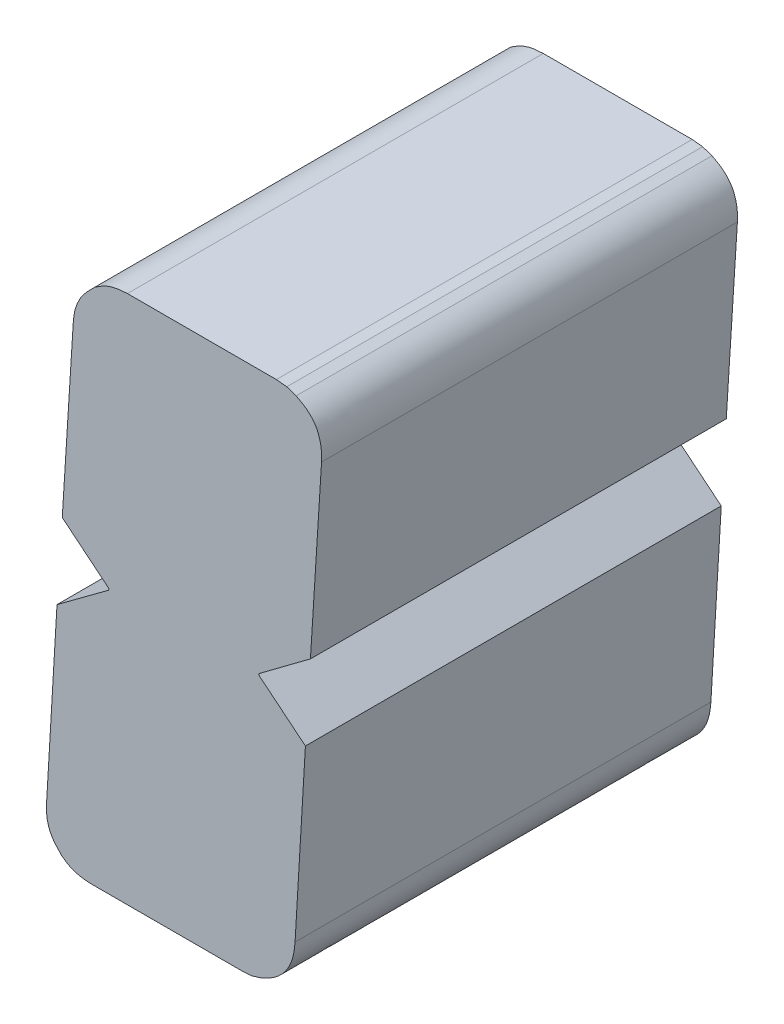
ISO-10303-21;
HEADER;
FILE_DESCRIPTION(('STEP AP214'),'2;1');
FILE_NAME('part.step','',(''),(''),'','','');
FILE_SCHEMA(('AUTOMOTIVE_DESIGN { 1 0 10303 214 1 1 1 1 }'));
ENDSEC;
DATA;
#1=APPLICATION_CONTEXT('core data for automotive mechanical design processes');
#2=APPLICATION_PROTOCOL_DEFINITION('international standard','automotive_design',2000,#1);
#3=PRODUCT_CONTEXT('',#1,'mechanical');
#4=PRODUCT('Part','Part','',(#3));
#5=PRODUCT_RELATED_PRODUCT_CATEGORY('part','',(#4));
#6=PRODUCT_DEFINITION_FORMATION('','',#4);
#7=PRODUCT_DEFINITION_CONTEXT('part definition',#1,'design');
#8=PRODUCT_DEFINITION('design','',#6,#7);
#9=PRODUCT_DEFINITION_SHAPE('','',#8);
#10=(LENGTH_UNIT() NAMED_UNIT(*) SI_UNIT(.MILLI.,.METRE.));
#11=(NAMED_UNIT(*) PLANE_ANGLE_UNIT() SI_UNIT($,.RADIAN.));
#12=(NAMED_UNIT(*) SI_UNIT($,.STERADIAN.) SOLID_ANGLE_UNIT());
#13=UNCERTAINTY_MEASURE_WITH_UNIT(LENGTH_MEASURE(1.E-05),#10,'distance_accuracy_value','');
#14=(GEOMETRIC_REPRESENTATION_CONTEXT(3) GLOBAL_UNCERTAINTY_ASSIGNED_CONTEXT((#13)) GLOBAL_UNIT_ASSIGNED_CONTEXT((#10,
#11,#12)) REPRESENTATION_CONTEXT('',''));
#15=CARTESIAN_POINT('',(0.,0.,0.));
#16=DIRECTION('',(0.,0.,1.));
#17=DIRECTION('',(1.,0.,0.));
#18=AXIS2_PLACEMENT_3D('',#15,#16,#17);
#19=CARTESIAN_POINT('',(-1.43719380701139,-2.18516352004764,0.));
#20=DIRECTION('',(0.,0.,-1.));
#21=DIRECTION('',(-1.,0.,0.));
#22=AXIS2_PLACEMENT_3D('',#19,#20,#21);
#23=PLANE('',#22);
#24=DIRECTION('',(-0.0629956112398929,-0.998013803994971,0.));
#25=VECTOR('',#24,1.);
#26=CARTESIAN_POINT('',(-0.996859150546409,2.17540462830096,0.));
#27=LINE('',#26,#25);
#28=CARTESIAN_POINT('',(-1.01112432138006,1.94940733851967,0.));
#29=VERTEX_POINT('',#28);
#30=CARTESIAN_POINT('',(-1.11218839294053,0.348290427038476,0.));
#31=VERTEX_POINT('',#30);
#32=EDGE_CURVE('E443',#29,#31,#27,.T.);
#33=ORIENTED_EDGE('',*,*,#32,.F.);
#34=CARTESIAN_POINT('',(-0.890962738372066,2.24236027187582,0.));
#35=CARTESIAN_POINT('',(-0.908040344985416,2.2216435503971,0.));
#36=CARTESIAN_POINT('',(-0.925227905547242,2.20099741701442,0.));
#37=CARTESIAN_POINT('',(-0.954461408277091,2.15640434061114,0.));
#38=CARTESIAN_POINT('',(-0.966010445699758,2.1320552290783,0.));
#39=CARTESIAN_POINT('',(-0.986425308372956,2.08199531247794,0.));
#40=CARTESIAN_POINT('',(-0.995138703432248,2.05640124055581,0.));
#41=CARTESIAN_POINT('',(-1.00571753288547,2.00325943194031,0.));
#42=CARTESIAN_POINT('',(-1.00832936844511,1.97632081132636,0.));
#43=CARTESIAN_POINT('',(-1.01112432138006,1.94940733851967,0.));
#44=B_SPLINE_CURVE_WITH_KNOTS('',3,(#34,#35,#36,#37,#38,#39,#40,#41,#42,#43),.UNSPECIFIED.,.F.,
.F.,(4,2,2,2,4),(0.,0.25,0.5,0.75,1.),.UNSPECIFIED.);
#45=CARTESIAN_POINT('',(-0.890962738372066,2.24236027187582,0.));
#46=VERTEX_POINT('',#45);
#47=EDGE_CURVE('E277',#46,#29,#44,.T.);
#48=ORIENTED_EDGE('',*,*,#47,.F.);
#49=DIRECTION('',(-0.699624792608215,-0.714510426493493,0.));
#50=VECTOR('',#49,1.);
#51=CARTESIAN_POINT('',(-1.05102460286801,2.07889283579486,0.));
#52=LINE('',#51,#50);
#53=CARTESIAN_POINT('',(-0.816049696278487,2.31886720848203,0.));
#54=VERTEX_POINT('',#53);
#55=EDGE_CURVE('E514',#54,#46,#52,.T.);
#56=ORIENTED_EDGE('',*,*,#55,.F.);
#57=CARTESIAN_POINT('',(-0.516702668850851,2.41871701152775,0.));
#58=CARTESIAN_POINT('',(-0.570312193003978,2.41647998090553,0.));
#59=CARTESIAN_POINT('',(-0.623850036610658,2.41190232353293,0.));
#60=CARTESIAN_POINT('',(-0.726132172515437,2.37713701742197,0.));
#61=CARTESIAN_POINT('',(-0.771962058489298,2.34965807582881,0.));
#62=CARTESIAN_POINT('',(-0.816049696278484,2.31886720848204,0.));
#63=B_SPLINE_CURVE_WITH_KNOTS('',3,(#57,#58,#59,#60,#61,#62),.UNSPECIFIED.,.F.,.F.,(4,2,4),(0.,
0.5,1.),.UNSPECIFIED.);
#64=CARTESIAN_POINT('',(-0.516702668850851,2.41871701152775,0.));
#65=VERTEX_POINT('',#64);
#66=EDGE_CURVE('E517',#65,#54,#63,.T.);
#67=ORIENTED_EDGE('',*,*,#66,.F.);
#68=DIRECTION('',(-1.,0.,0.));
#69=VECTOR('',#68,1.);
#70=CARTESIAN_POINT('',(-1.16011388815208,2.41871701152775,0.));
#71=LINE('',#70,#69);
#72=CARTESIAN_POINT('',(0.844231341113559,2.41871701152775,0.));
#73=VERTEX_POINT('',#72);
#74=EDGE_CURVE('E520',#73,#65,#71,.T.);
#75=ORIENTED_EDGE('',*,*,#74,.F.);
#76=DIRECTION('',(-0.99488208865454,0.10104271212898,0.));
#77=VECTOR('',#76,1.);
#78=CARTESIAN_POINT('',(-1.11622704206118,2.61782606606894,0.));
#79=LINE('',#78,#77);
#80=CARTESIAN_POINT('',(0.939111556732335,2.40908073962897,0.));
#81=VERTEX_POINT('',#80);
#82=EDGE_CURVE('E684',#81,#73,#79,.T.);
#83=ORIENTED_EDGE('',*,*,#82,.F.);
#84=DIRECTION('',(-0.946291022800123,0.323316099456704,0.));
#85=VECTOR('',#84,1.);
#86=CARTESIAN_POINT('',(-0.872334220976006,3.02799138034597,0.));
#87=LINE('',#86,#85);
#88=CARTESIAN_POINT('',(1.02473831085206,2.3798249319714,0.));
#89=VERTEX_POINT('',#88);
#90=EDGE_CURVE('E685',#89,#81,#87,.T.);
#91=ORIENTED_EDGE('',*,*,#90,.F.);
#92=CARTESIAN_POINT('',(1.25727268702418,1.97236385982051,0.));
#93=CARTESIAN_POINT('',(1.2581138756825,2.01430850970678,0.));
#94=CARTESIAN_POINT('',(1.25841778484488,2.05618374871578,0.));
#95=CARTESIAN_POINT('',(1.24420198154978,2.13801917025248,0.));
#96=CARTESIAN_POINT('',(1.23225328315968,2.17942948606228,0.));
#97=CARTESIAN_POINT('',(1.19270387969881,2.25317642300351,0.));
#98=CARTESIAN_POINT('',(1.16434271527264,2.28569752565159,0.));
#99=CARTESIAN_POINT('',(1.10027483678842,2.34020055274425,0.));
#100=CARTESIAN_POINT('',(1.06276723899746,2.36089711384039,0.));
#101=CARTESIAN_POINT('',(1.02473831085199,2.37982493197143,0.));
#102=B_SPLINE_CURVE_WITH_KNOTS('',3,(#92,#93,#94,#95,#96,#97,#98,#99,#100,#101),.UNSPECIFIED.,
.F.,.F.,(4,2,2,2,4),(0.,0.25,0.5,0.75,1.),.UNSPECIFIED.);
#103=CARTESIAN_POINT('',(1.25727268702418,1.97236385982051,0.));
#104=VERTEX_POINT('',#103);
#105=EDGE_CURVE('E690',#104,#89,#102,.T.);
#106=ORIENTED_EDGE('',*,*,#105,.F.);
#107=DIRECTION('',(0.063069040355427,0.998009166365042,0.));
#108=VECTOR('',#107,1.);
#109=CARTESIAN_POINT('',(1.26108575169763,2.03270207766256,0.));
#110=LINE('',#109,#108);
#111=CARTESIAN_POINT('',(1.15559408106132,0.363394067315748,0.));
#112=VERTEX_POINT('',#111);
#113=EDGE_CURVE('E696',#112,#104,#110,.T.);
#114=ORIENTED_EDGE('',*,*,#113,.F.);
#115=DIRECTION('',(0.801257856401325,0.598319185347715,0.));
#116=VECTOR('',#115,1.);
#117=CARTESIAN_POINT('',(0.542509259206344,-0.0944116293532548,0.));
#118=LINE('',#117,#116);
#119=CARTESIAN_POINT('',(0.683073322133881,0.0105510551908889,0.));
#120=VERTEX_POINT('',#119);
#121=EDGE_CURVE('E763',#120,#112,#118,.T.);
#122=ORIENTED_EDGE('',*,*,#121,.F.);
#123=DIRECTION('',(-0.784634745814209,0.619958317680367,0.));
#124=VECTOR('',#123,1.);
#125=CARTESIAN_POINT('',(-1.50977384774873,1.74317104127099,0.));
#126=LINE('',#125,#124);
#127=CARTESIAN_POINT('',(0.686913474937316,0.00751686038323663,0.));
#128=VERTEX_POINT('',#127);
#129=EDGE_CURVE('E761',#128,#120,#126,.T.);
#130=ORIENTED_EDGE('',*,*,#129,.F.);
#131=DIRECTION('',(0.811880248653885,0.583823999031992,0.));
#132=VECTOR('',#131,1.);
#133=CARTESIAN_POINT('',(0.501899005438895,-0.1255272525145,0.));
#134=LINE('',#133,#132);
#135=CARTESIAN_POINT('',(0.680300718272833,0.00276161963574346,0.));
#136=VERTEX_POINT('',#135);
#137=EDGE_CURVE('E758',#136,#128,#134,.T.);
#138=ORIENTED_EDGE('',*,*,#137,.F.);
#139=DIRECTION('',(-0.773957299203321,0.633237790257262,0.));
#140=VECTOR('',#139,1.);
#141=CARTESIAN_POINT('',(-1.49198641226871,1.78008745371518,0.));
#142=LINE('',#141,#140);
#143=CARTESIAN_POINT('',(1.10975234037325,-0.348607889355504,0.));
#144=VERTEX_POINT('',#143);
#145=EDGE_CURVE('E755',#144,#136,#142,.T.);
#146=ORIENTED_EDGE('',*,*,#145,.F.);
#147=DIRECTION('',(0.0590303717234863,0.998256187165493,0.));
#148=VECTOR('',#147,1.);
#149=CARTESIAN_POINT('',(1.25118361498193,2.04312099214573,0.));
#150=LINE('',#149,#148);
#151=CARTESIAN_POINT('',(1.0152121936779,-1.94736601366888,0.));
#152=VERTEX_POINT('',#151);
#153=EDGE_CURVE('E747',#152,#144,#150,.T.);
#154=ORIENTED_EDGE('',*,*,#153,.F.);
#155=CARTESIAN_POINT('',(0.709904759173197,-2.38462017092752,0.));
#156=CARTESIAN_POINT('',(0.752821680239164,-2.36489662640091,0.));
#157=CARTESIAN_POINT('',(0.795043998863421,-2.3441369487027,0.));
#158=CARTESIAN_POINT('',(0.870185675204184,-2.28874043737623,0.));
#159=CARTESIAN_POINT('',(0.904729385897159,-2.25456271232383,0.));
#160=CARTESIAN_POINT('',(0.958681636041364,-2.17703424930174,0.));
#161=CARTESIAN_POINT('',(0.979317246973203,-2.13322223892032,0.));
#162=CARTESIAN_POINT('',(1.00562776036756,-2.04237293710442,0.));
#163=CARTESIAN_POINT('',(1.01055566962311,-1.99479327532623,0.));
#164=CARTESIAN_POINT('',(1.0152121936779,-1.94736601366888,0.));
#165=B_SPLINE_CURVE_WITH_KNOTS('',3,(#155,#156,#157,#158,#159,#160,#161,#162,#163,#164),
.UNSPECIFIED.,.F.,.F.,(4,2,2,2,4),(0.,0.25,0.5,0.75,1.),.UNSPECIFIED.);
#166=CARTESIAN_POINT('',(0.709904759173197,-2.38462017092752,0.));
#167=VERTEX_POINT('',#166);
#168=EDGE_CURVE('E740',#167,#152,#165,.T.);
#169=ORIENTED_EDGE('',*,*,#168,.F.);
#170=DIRECTION('',(0.955136383278741,0.296166320396508,0.));
#171=VECTOR('',#170,1.);
#172=CARTESIAN_POINT('',(0.296765151610304,-2.51272547559818,0.));
#173=LINE('',#172,#171);
#174=CARTESIAN_POINT('',(0.617154733206031,-2.41337986890184,0.));
#175=VERTEX_POINT('',#174);
#176=EDGE_CURVE('E748',#175,#167,#173,.T.);
#177=ORIENTED_EDGE('',*,*,#176,.F.);
#178=DIRECTION('',(0.99850798449248,0.0546059054019324,0.));
#179=VECTOR('',#178,1.);
#180=CARTESIAN_POINT('',(-0.904051685745701,-2.49657084493826,0.));
#181=LINE('',#180,#179);
#182=CARTESIAN_POINT('',(0.519561268046444,-2.41871701152775,0.));
#183=VERTEX_POINT('',#182);
#184=EDGE_CURVE('E790',#183,#175,#181,.T.);
#185=ORIENTED_EDGE('',*,*,#184,.F.);
#186=DIRECTION('',(1.,0.,0.));
#187=VECTOR('',#186,1.);
#188=CARTESIAN_POINT('',(-1.16011388815208,-2.41871701152775,0.));
#189=LINE('',#188,#187);
#190=CARTESIAN_POINT('',(-0.843701006559318,-2.41871701152775,0.));
#191=VERTEX_POINT('',#190);
#192=EDGE_CURVE('E791',#191,#183,#189,.T.);
#193=ORIENTED_EDGE('',*,*,#192,.F.);
#194=CARTESIAN_POINT('',(-1.11755909845156,-2.33010674205506,0.));
#195=CARTESIAN_POINT('',(-1.09785273994237,-2.34479279060464,0.));
#196=CARTESIAN_POINT('',(-1.07810377865326,-2.35940160424777,0.));
#197=CARTESIAN_POINT('',(-1.03541007487244,-2.3828255752826,0.));
#198=CARTESIAN_POINT('',(-1.0124636893228,-2.39195523727551,0.));
#199=CARTESIAN_POINT('',(-0.941603833949698,-2.41357345525233,0.));
#200=CARTESIAN_POINT('',(-0.892704311148555,-2.41650421884631,0.));
#201=CARTESIAN_POINT('',(-0.843701006559312,-2.41871701152775,0.));
#202=B_SPLINE_CURVE_WITH_KNOTS('',3,(#194,#195,#196,#197,#198,#199,#200,#201),.UNSPECIFIED.,.F.,
.F.,(4,2,2,4),(0.,0.25,0.500000000000001,1.),.UNSPECIFIED.);
#203=CARTESIAN_POINT('',(-1.11755909845156,-2.33010674205506,0.));
#204=VERTEX_POINT('',#203);
#205=EDGE_CURVE('E794',#204,#191,#202,.T.);
#206=ORIENTED_EDGE('',*,*,#205,.F.);
#207=DIRECTION('',(0.675724628517347,-0.737154140200741,0.));
#208=VECTOR('',#207,1.);
#209=CARTESIAN_POINT('',(-3.38637745299081,0.144967826533329,0.));
#210=LINE('',#209,#208);
#211=CARTESIAN_POINT('',(-1.18314999807141,-2.25855303337875,0.));
#212=VERTEX_POINT('',#211);
#213=EDGE_CURVE('E464',#212,#204,#210,.T.);
#214=ORIENTED_EDGE('',*,*,#213,.F.);
#215=CARTESIAN_POINT('',(-1.25519712705628,-1.97462104315552,0.));
#216=CARTESIAN_POINT('',(-1.25703230873838,-2.02443157901301,0.));
#217=CARTESIAN_POINT('',(-1.25798384630833,-2.07442359628306,0.));
#218=CARTESIAN_POINT('',(-1.24075152722987,-2.14778758993915,0.));
#219=CARTESIAN_POINT('',(-1.23328040214714,-2.17182733541969,0.));
#220=CARTESIAN_POINT('',(-1.21152799941701,-2.21718178570002,0.));
#221=CARTESIAN_POINT('',(-1.19727292501901,-2.23782768708621,0.));
#222=CARTESIAN_POINT('',(-1.18314999807117,-2.25855303337911,0.));
#223=B_SPLINE_CURVE_WITH_KNOTS('',3,(#215,#216,#217,#218,#219,#220,#221,#222),.UNSPECIFIED.,.F.,
.F.,(4,2,2,4),(0.,0.5,0.75,1.),.UNSPECIFIED.);
#224=CARTESIAN_POINT('',(-1.25519712705628,-1.97462104315552,0.));
#225=VERTEX_POINT('',#224);
#226=EDGE_CURVE('E458',#225,#212,#223,.T.);
#227=ORIENTED_EDGE('',*,*,#226,.F.);
#228=DIRECTION('',(-0.058995951094308,-0.998258221981907,0.));
#229=VECTOR('',#228,1.);
#230=CARTESIAN_POINT('',(-1.00985104135484,2.1768290604462,0.));
#231=LINE('',#230,#229);
#232=CARTESIAN_POINT('',(-1.16004155867173,-0.364513455341602,0.));
#233=VERTEX_POINT('',#232);
#234=EDGE_CURVE('E455',#233,#225,#231,.T.);
#235=ORIENTED_EDGE('',*,*,#234,.F.);
#236=DIRECTION('',(-0.803311771616124,-0.595558727232642,0.));
#237=VECTOR('',#236,1.);
#238=CARTESIAN_POINT('',(0.0599877054320527,0.539990999080165,0.));
#239=LINE('',#238,#237);
#240=CARTESIAN_POINT('',(-0.684303055329405,-0.011810771829191,0.));
#241=VERTEX_POINT('',#240);
#242=EDGE_CURVE('E449',#241,#233,#239,.T.);
#243=ORIENTED_EDGE('',*,*,#242,.F.);
#244=DIRECTION('',(0.784634745814209,-0.619958317680367,0.));
#245=VECTOR('',#244,1.);
#246=CARTESIAN_POINT('',(-2.04620036115417,1.06425623524224,0.));
#247=LINE('',#246,#245);
#248=CARTESIAN_POINT('',(-0.689507134829485,-0.00769890654517713,0.));
#249=VERTEX_POINT('',#248);
#250=EDGE_CURVE('E447',#249,#241,#247,.T.);
#251=ORIENTED_EDGE('',*,*,#250,.F.);
#252=DIRECTION('',(-0.812500733959509,-0.582960167863345,0.));
#253=VECTOR('',#252,1.);
#254=CARTESIAN_POINT('',(0.0387383765617318,0.514809083690691,0.));
#255=LINE('',#254,#253);
#256=CARTESIAN_POINT('',(-0.682891644982969,-0.00295236674498595,0.));
#257=VERTEX_POINT('',#256);
#258=EDGE_CURVE('E430',#257,#249,#255,.T.);
#259=ORIENTED_EDGE('',*,*,#258,.F.);
#260=DIRECTION('',(0.773957299203321,-0.633237790257263,0.));
#261=VECTOR('',#260,1.);
#262=CARTESIAN_POINT('',(-2.04141347204797,1.10856549176275,0.));
#263=LINE('',#262,#261);
#264=EDGE_CURVE('E438',#31,#257,#263,.T.);
#265=ORIENTED_EDGE('',*,*,#264,.F.);
#266=EDGE_LOOP('',(#33,#48,#56,#67,#75,#83,#91,#106,#114,#122,#130,#138,#146,#154,#169,#177,
#185,#193,#206,#214,#227,#235,#243,#251,#259,#265));
#267=FACE_BOUND('',#266,.T.);
#268=ADVANCED_FACE('F253',(#267),#23,.T.);
#269=DIRECTION('',(0.,0.,1.));
#270=VECTOR('',#269,1.);
#271=SURFACE_OF_LINEAR_EXTRUSION('',#44,#270);
#272=CARTESIAN_POINT('',(-0.890962738372066,2.24236027187582,3.8));
#273=CARTESIAN_POINT('',(-0.908040344985416,2.2216435503971,3.8));
#274=CARTESIAN_POINT('',(-0.925227905547242,2.20099741701442,3.8));
#275=CARTESIAN_POINT('',(-0.954461408277091,2.15640434061114,3.8));
#276=CARTESIAN_POINT('',(-0.966010445699758,2.1320552290783,3.8));
#277=CARTESIAN_POINT('',(-0.986425308372956,2.08199531247794,3.8));
#278=CARTESIAN_POINT('',(-0.995138703432248,2.05640124055581,3.8));
#279=CARTESIAN_POINT('',(-1.00571753288547,2.00325943194031,3.8));
#280=CARTESIAN_POINT('',(-1.00832936844511,1.97632081132636,3.8));
#281=CARTESIAN_POINT('',(-1.01112432138006,1.94940733851967,3.8));
#282=B_SPLINE_CURVE_WITH_KNOTS('',3,(#272,#273,#274,#275,#276,#277,#278,#279,#280,#281),
.UNSPECIFIED.,.F.,.F.,(4,2,2,2,4),(0.,0.25,0.5,0.75,1.),.UNSPECIFIED.);
#283=CARTESIAN_POINT('',(-0.890962738372066,2.24236027187582,3.8));
#284=VERTEX_POINT('',#283);
#285=CARTESIAN_POINT('',(-1.01112432138006,1.94940733851967,3.8));
#286=VERTEX_POINT('',#285);
#287=EDGE_CURVE('E527',#284,#286,#282,.T.);
#288=ORIENTED_EDGE('',*,*,#287,.F.);
#289=DIRECTION('',(0.,0.,1.));
#290=VECTOR('',#289,1.);
#291=CARTESIAN_POINT('',(-0.890962738372066,2.24236027187582,0.));
#292=LINE('',#291,#290);
#293=EDGE_CURVE('E12',#46,#284,#292,.T.);
#294=ORIENTED_EDGE('',*,*,#293,.F.);
#295=ORIENTED_EDGE('',*,*,#47,.T.);
#296=DIRECTION('',(0.,0.,1.));
#297=VECTOR('',#296,1.);
#298=CARTESIAN_POINT('',(-1.01112432138006,1.94940733851967,0.));
#299=LINE('',#298,#297);
#300=EDGE_CURVE('E256',#29,#286,#299,.T.);
#301=ORIENTED_EDGE('',*,*,#300,.T.);
#302=EDGE_LOOP('',(#288,#294,#295,#301));
#303=FACE_BOUND('',#302,.T.);
#304=ADVANCED_FACE('F498',(#303),#271,.T.);
#305=CARTESIAN_POINT('',(-1.05102460286801,2.07889283579486,0.));
#306=DIRECTION('',(-0.714510426493493,0.699624792608215,0.));
#307=DIRECTION('',(-0.699624792608215,-0.714510426493493,0.));
#308=AXIS2_PLACEMENT_3D('',#305,#306,#307);
#309=PLANE('',#308);
#310=DIRECTION('',(-0.699624792608215,-0.714510426493493,0.));
#311=VECTOR('',#310,1.);
#312=CARTESIAN_POINT('',(-1.05102460286801,2.07889283579486,3.8));
#313=LINE('',#312,#311);
#314=CARTESIAN_POINT('',(-0.816049696278487,2.31886720848203,3.8));
#315=VERTEX_POINT('',#314);
#316=EDGE_CURVE('E505',#315,#284,#313,.T.);
#317=ORIENTED_EDGE('',*,*,#316,.F.);
#318=DIRECTION('',(0.,0.,1.));
#319=VECTOR('',#318,1.);
#320=CARTESIAN_POINT('',(-0.816049696278487,2.31886720848203,0.));
#321=LINE('',#320,#319);
#322=EDGE_CURVE('E261',#54,#315,#321,.T.);
#323=ORIENTED_EDGE('',*,*,#322,.F.);
#324=ORIENTED_EDGE('',*,*,#55,.T.);
#325=ORIENTED_EDGE('',*,*,#293,.T.);
#326=EDGE_LOOP('',(#317,#323,#324,#325));
#327=FACE_BOUND('',#326,.T.);
#328=ADVANCED_FACE('F501',(#327),#309,.T.);
#329=DIRECTION('',(0.,0.,1.));
#330=VECTOR('',#329,1.);
#331=SURFACE_OF_LINEAR_EXTRUSION('',#63,#330);
#332=CARTESIAN_POINT('',(-0.516702668850851,2.41871701152775,3.8));
#333=CARTESIAN_POINT('',(-0.570312193003978,2.41647998090553,3.8));
#334=CARTESIAN_POINT('',(-0.623850036610658,2.41190232353293,3.8));
#335=CARTESIAN_POINT('',(-0.726132172515437,2.37713701742197,3.8));
#336=CARTESIAN_POINT('',(-0.771962058489298,2.34965807582881,3.8));
#337=CARTESIAN_POINT('',(-0.816049696278484,2.31886720848204,3.8));
#338=B_SPLINE_CURVE_WITH_KNOTS('',3,(#332,#333,#334,#335,#336,#337),.UNSPECIFIED.,.F.,.F.,(4,2,
4),(0.,0.5,1.),.UNSPECIFIED.);
#339=CARTESIAN_POINT('',(-0.516702668850851,2.41871701152775,3.8));
#340=VERTEX_POINT('',#339);
#341=EDGE_CURVE('E619',#340,#315,#338,.T.);
#342=ORIENTED_EDGE('',*,*,#341,.F.);
#343=DIRECTION('',(0.,0.,1.));
#344=VECTOR('',#343,1.);
#345=CARTESIAN_POINT('',(-0.516702668850851,2.41871701152775,0.));
#346=LINE('',#345,#344);
#347=EDGE_CURVE('E630',#65,#340,#346,.T.);
#348=ORIENTED_EDGE('',*,*,#347,.F.);
#349=ORIENTED_EDGE('',*,*,#66,.T.);
#350=ORIENTED_EDGE('',*,*,#322,.T.);
#351=EDGE_LOOP('',(#342,#348,#349,#350));
#352=FACE_BOUND('',#351,.T.);
#353=ADVANCED_FACE('F678',(#352),#331,.T.);
#354=CARTESIAN_POINT('',(-1.16011388815208,2.41871701152775,0.));
#355=DIRECTION('',(0.,1.,0.));
#356=DIRECTION('',(0.,0.,1.));
#357=AXIS2_PLACEMENT_3D('',#354,#355,#356);
#358=PLANE('',#357);
#359=DIRECTION('',(-1.,0.,0.));
#360=VECTOR('',#359,1.);
#361=CARTESIAN_POINT('',(-1.16011388815208,2.41871701152775,3.8));
#362=LINE('',#361,#360);
#363=CARTESIAN_POINT('',(0.844231341113559,2.41871701152775,3.8));
#364=VERTEX_POINT('',#363);
#365=EDGE_CURVE('E616',#364,#340,#362,.T.);
#366=ORIENTED_EDGE('',*,*,#365,.F.);
#367=DIRECTION('',(0.,0.,1.));
#368=VECTOR('',#367,1.);
#369=CARTESIAN_POINT('',(0.844231341113559,2.41871701152775,0.));
#370=LINE('',#369,#368);
#371=EDGE_CURVE('E632',#73,#364,#370,.T.);
#372=ORIENTED_EDGE('',*,*,#371,.F.);
#373=ORIENTED_EDGE('',*,*,#74,.T.);
#374=ORIENTED_EDGE('',*,*,#347,.T.);
#375=EDGE_LOOP('',(#366,#372,#373,#374));
#376=FACE_BOUND('',#375,.T.);
#377=ADVANCED_FACE('F681',(#376),#358,.T.);
#378=CARTESIAN_POINT('',(-1.11622704206118,2.61782606606894,0.));
#379=DIRECTION('',(0.10104271212898,0.99488208865454,0.));
#380=DIRECTION('',(-0.99488208865454,0.10104271212898,0.));
#381=AXIS2_PLACEMENT_3D('',#378,#379,#380);
#382=PLANE('',#381);
#383=DIRECTION('',(-0.99488208865454,0.10104271212898,0.));
#384=VECTOR('',#383,1.);
#385=CARTESIAN_POINT('',(-1.11622704206118,2.61782606606894,3.8));
#386=LINE('',#385,#384);
#387=CARTESIAN_POINT('',(0.939111556732335,2.40908073962897,3.8));
#388=VERTEX_POINT('',#387);
#389=EDGE_CURVE('E613',#388,#364,#386,.T.);
#390=ORIENTED_EDGE('',*,*,#389,.F.);
#391=DIRECTION('',(0.,0.,1.));
#392=VECTOR('',#391,1.);
#393=CARTESIAN_POINT('',(0.939111556732335,2.40908073962897,0.));
#394=LINE('',#393,#392);
#395=EDGE_CURVE('E634',#81,#388,#394,.T.);
#396=ORIENTED_EDGE('',*,*,#395,.F.);
#397=ORIENTED_EDGE('',*,*,#82,.T.);
#398=ORIENTED_EDGE('',*,*,#371,.T.);
#399=EDGE_LOOP('',(#390,#396,#397,#398));
#400=FACE_BOUND('',#399,.T.);
#401=ADVANCED_FACE('F841',(#400),#382,.T.);
#402=CARTESIAN_POINT('',(-0.872334220976006,3.02799138034597,0.));
#403=DIRECTION('',(0.323316099456703,0.946291022800123,0.));
#404=DIRECTION('',(-0.946291022800123,0.323316099456704,0.));
#405=AXIS2_PLACEMENT_3D('',#402,#403,#404);
#406=PLANE('',#405);
#407=DIRECTION('',(-0.946291022800123,0.323316099456704,0.));
#408=VECTOR('',#407,1.);
#409=CARTESIAN_POINT('',(-0.872334220976006,3.02799138034597,3.8));
#410=LINE('',#409,#408);
#411=CARTESIAN_POINT('',(1.02473831085206,2.3798249319714,3.8));
#412=VERTEX_POINT('',#411);
#413=EDGE_CURVE('E607',#412,#388,#410,.T.);
#414=ORIENTED_EDGE('',*,*,#413,.F.);
#415=DIRECTION('',(0.,0.,1.));
#416=VECTOR('',#415,1.);
#417=CARTESIAN_POINT('',(1.02473831085206,2.3798249319714,0.));
#418=LINE('',#417,#416);
#419=EDGE_CURVE('E636',#89,#412,#418,.T.);
#420=ORIENTED_EDGE('',*,*,#419,.F.);
#421=ORIENTED_EDGE('',*,*,#90,.T.);
#422=ORIENTED_EDGE('',*,*,#395,.T.);
#423=EDGE_LOOP('',(#414,#420,#421,#422));
#424=FACE_BOUND('',#423,.T.);
#425=ADVANCED_FACE('F707',(#424),#406,.T.);
#426=DIRECTION('',(0.,0.,1.));
#427=VECTOR('',#426,1.);
#428=SURFACE_OF_LINEAR_EXTRUSION('',#102,#427);
#429=CARTESIAN_POINT('',(1.25727268702418,1.97236385982051,3.8));
#430=CARTESIAN_POINT('',(1.2581138756825,2.01430850970678,3.8));
#431=CARTESIAN_POINT('',(1.25841778484488,2.05618374871578,3.8));
#432=CARTESIAN_POINT('',(1.24420198154978,2.13801917025248,3.8));
#433=CARTESIAN_POINT('',(1.23225328315968,2.17942948606228,3.8));
#434=CARTESIAN_POINT('',(1.19270387969881,2.25317642300351,3.8));
#435=CARTESIAN_POINT('',(1.16434271527264,2.28569752565159,3.8));
#436=CARTESIAN_POINT('',(1.10027483678842,2.34020055274425,3.8));
#437=CARTESIAN_POINT('',(1.06276723899746,2.36089711384039,3.8));
#438=CARTESIAN_POINT('',(1.02473831085199,2.37982493197143,3.8));
#439=B_SPLINE_CURVE_WITH_KNOTS('',3,(#429,#430,#431,#432,#433,#434,#435,#436,#437,#438),
.UNSPECIFIED.,.F.,.F.,(4,2,2,2,4),(0.,0.25,0.5,0.75,1.),.UNSPECIFIED.);
#440=CARTESIAN_POINT('',(1.25727268702418,1.97236385982051,3.8));
#441=VERTEX_POINT('',#440);
#442=EDGE_CURVE('E602',#441,#412,#439,.T.);
#443=ORIENTED_EDGE('',*,*,#442,.F.);
#444=DIRECTION('',(0.,0.,1.));
#445=VECTOR('',#444,1.);
#446=CARTESIAN_POINT('',(1.25727268702418,1.97236385982051,0.));
#447=LINE('',#446,#445);
#448=EDGE_CURVE('E638',#104,#441,#447,.T.);
#449=ORIENTED_EDGE('',*,*,#448,.F.);
#450=ORIENTED_EDGE('',*,*,#105,.T.);
#451=ORIENTED_EDGE('',*,*,#419,.T.);
#452=EDGE_LOOP('',(#443,#449,#450,#451));
#453=FACE_BOUND('',#452,.T.);
#454=ADVANCED_FACE('F702',(#453),#428,.T.);
#455=CARTESIAN_POINT('',(1.26108575169763,2.03270207766256,0.));
#456=DIRECTION('',(0.998009166365042,-0.063069040355427,0.));
#457=DIRECTION('',(0.063069040355427,0.998009166365042,0.));
#458=AXIS2_PLACEMENT_3D('',#455,#456,#457);
#459=PLANE('',#458);
#460=DIRECTION('',(0.063069040355427,0.998009166365042,0.));
#461=VECTOR('',#460,1.);
#462=CARTESIAN_POINT('',(1.26108575169763,2.03270207766256,3.8));
#463=LINE('',#462,#461);
#464=CARTESIAN_POINT('',(1.15559408106132,0.363394067315748,3.8));
#465=VERTEX_POINT('',#464);
#466=EDGE_CURVE('E599',#465,#441,#463,.T.);
#467=ORIENTED_EDGE('',*,*,#466,.F.);
#468=DIRECTION('',(0.,0.,1.));
#469=VECTOR('',#468,1.);
#470=CARTESIAN_POINT('',(1.15559408106132,0.363394067315748,0.));
#471=LINE('',#470,#469);
#472=EDGE_CURVE('E640',#112,#465,#471,.T.);
#473=ORIENTED_EDGE('',*,*,#472,.F.);
#474=ORIENTED_EDGE('',*,*,#113,.T.);
#475=ORIENTED_EDGE('',*,*,#448,.T.);
#476=EDGE_LOOP('',(#467,#473,#474,#475));
#477=FACE_BOUND('',#476,.T.);
#478=ADVANCED_FACE('F706',(#477),#459,.T.);
#479=CARTESIAN_POINT('',(0.542509259206344,-0.0944116293532548,0.));
#480=DIRECTION('',(0.598319185347715,-0.801257856401325,0.));
#481=DIRECTION('',(0.801257856401325,0.598319185347715,0.));
#482=AXIS2_PLACEMENT_3D('',#479,#480,#481);
#483=PLANE('',#482);
#484=DIRECTION('',(0.801257856401325,0.598319185347715,0.));
#485=VECTOR('',#484,1.);
#486=CARTESIAN_POINT('',(0.542509259206344,-0.0944116293532548,3.8));
#487=LINE('',#486,#485);
#488=CARTESIAN_POINT('',(0.683073322133881,0.0105510551908889,3.8));
#489=VERTEX_POINT('',#488);
#490=EDGE_CURVE('E596',#489,#465,#487,.T.);
#491=ORIENTED_EDGE('',*,*,#490,.F.);
#492=DIRECTION('',(0.,0.,1.));
#493=VECTOR('',#492,1.);
#494=CARTESIAN_POINT('',(0.683073322133881,0.0105510551908889,0.));
#495=LINE('',#494,#493);
#496=EDGE_CURVE('E642',#120,#489,#495,.T.);
#497=ORIENTED_EDGE('',*,*,#496,.F.);
#498=ORIENTED_EDGE('',*,*,#121,.T.);
#499=ORIENTED_EDGE('',*,*,#472,.T.);
#500=EDGE_LOOP('',(#491,#497,#498,#499));
#501=FACE_BOUND('',#500,.T.);
#502=ADVANCED_FACE('F712',(#501),#483,.T.);
#503=CARTESIAN_POINT('',(-1.50977384774873,1.74317104127099,0.));
#504=DIRECTION('',(0.619958317680367,0.784634745814209,0.));
#505=DIRECTION('',(-0.784634745814209,0.619958317680367,0.));
#506=AXIS2_PLACEMENT_3D('',#503,#504,#505);
#507=PLANE('',#506);
#508=DIRECTION('',(-0.784634745814209,0.619958317680367,0.));
#509=VECTOR('',#508,1.);
#510=CARTESIAN_POINT('',(-1.50977384774873,1.74317104127099,3.8));
#511=LINE('',#510,#509);
#512=CARTESIAN_POINT('',(0.686913474937316,0.00751686038323663,3.8));
#513=VERTEX_POINT('',#512);
#514=EDGE_CURVE('E593',#513,#489,#511,.T.);
#515=ORIENTED_EDGE('',*,*,#514,.F.);
#516=DIRECTION('',(0.,0.,1.));
#517=VECTOR('',#516,1.);
#518=CARTESIAN_POINT('',(0.686913474937316,0.00751686038323663,0.));
#519=LINE('',#518,#517);
#520=EDGE_CURVE('E644',#128,#513,#519,.T.);
#521=ORIENTED_EDGE('',*,*,#520,.F.);
#522=ORIENTED_EDGE('',*,*,#129,.T.);
#523=ORIENTED_EDGE('',*,*,#496,.T.);
#524=EDGE_LOOP('',(#515,#521,#522,#523));
#525=FACE_BOUND('',#524,.T.);
#526=ADVANCED_FACE('F716',(#525),#507,.T.);
#527=CARTESIAN_POINT('',(0.501899005438895,-0.1255272525145,0.));
#528=DIRECTION('',(0.583823999031992,-0.811880248653884,0.));
#529=DIRECTION('',(0.811880248653885,0.583823999031992,0.));
#530=AXIS2_PLACEMENT_3D('',#527,#528,#529);
#531=PLANE('',#530);
#532=DIRECTION('',(0.811880248653885,0.583823999031992,0.));
#533=VECTOR('',#532,1.);
#534=CARTESIAN_POINT('',(0.501899005438895,-0.1255272525145,3.8));
#535=LINE('',#534,#533);
#536=CARTESIAN_POINT('',(0.680300718272833,0.00276161963574346,3.8));
#537=VERTEX_POINT('',#536);
#538=EDGE_CURVE('E590',#537,#513,#535,.T.);
#539=ORIENTED_EDGE('',*,*,#538,.F.);
#540=DIRECTION('',(0.,0.,1.));
#541=VECTOR('',#540,1.);
#542=CARTESIAN_POINT('',(0.680300718272833,0.00276161963574346,0.));
#543=LINE('',#542,#541);
#544=EDGE_CURVE('E646',#136,#537,#543,.T.);
#545=ORIENTED_EDGE('',*,*,#544,.F.);
#546=ORIENTED_EDGE('',*,*,#137,.T.);
#547=ORIENTED_EDGE('',*,*,#520,.T.);
#548=EDGE_LOOP('',(#539,#545,#546,#547));
#549=FACE_BOUND('',#548,.T.);
#550=ADVANCED_FACE('F720',(#549),#531,.T.);
#551=CARTESIAN_POINT('',(-1.49198641226871,1.78008745371518,0.));
#552=DIRECTION('',(0.633237790257262,0.773957299203321,0.));
#553=DIRECTION('',(-0.773957299203322,0.633237790257262,0.));
#554=AXIS2_PLACEMENT_3D('',#551,#552,#553);
#555=PLANE('',#554);
#556=DIRECTION('',(-0.773957299203321,0.633237790257262,0.));
#557=VECTOR('',#556,1.);
#558=CARTESIAN_POINT('',(-1.49198641226871,1.78008745371518,3.8));
#559=LINE('',#558,#557);
#560=CARTESIAN_POINT('',(1.10975234037325,-0.348607889355504,3.8));
#561=VERTEX_POINT('',#560);
#562=EDGE_CURVE('E587',#561,#537,#559,.T.);
#563=ORIENTED_EDGE('',*,*,#562,.F.);
#564=DIRECTION('',(0.,0.,1.));
#565=VECTOR('',#564,1.);
#566=CARTESIAN_POINT('',(1.10975234037325,-0.348607889355504,0.));
#567=LINE('',#566,#565);
#568=EDGE_CURVE('E648',#144,#561,#567,.T.);
#569=ORIENTED_EDGE('',*,*,#568,.F.);
#570=ORIENTED_EDGE('',*,*,#145,.T.);
#571=ORIENTED_EDGE('',*,*,#544,.T.);
#572=EDGE_LOOP('',(#563,#569,#570,#571));
#573=FACE_BOUND('',#572,.T.);
#574=ADVANCED_FACE('F724',(#573),#555,.T.);
#575=CARTESIAN_POINT('',(1.25118361498193,2.04312099214573,0.));
#576=DIRECTION('',(0.998256187165493,-0.0590303717234863,0.));
#577=DIRECTION('',(0.0590303717234863,0.998256187165493,0.));
#578=AXIS2_PLACEMENT_3D('',#575,#576,#577);
#579=PLANE('',#578);
#580=DIRECTION('',(0.0590303717234863,0.998256187165493,0.));
#581=VECTOR('',#580,1.);
#582=CARTESIAN_POINT('',(1.25118361498193,2.04312099214573,3.8));
#583=LINE('',#582,#581);
#584=CARTESIAN_POINT('',(1.0152121936779,-1.94736601366888,3.8));
#585=VERTEX_POINT('',#584);
#586=EDGE_CURVE('E581',#585,#561,#583,.T.);
#587=ORIENTED_EDGE('',*,*,#586,.F.);
#588=DIRECTION('',(0.,0.,1.));
#589=VECTOR('',#588,1.);
#590=CARTESIAN_POINT('',(1.0152121936779,-1.94736601366888,0.));
#591=LINE('',#590,#589);
#592=EDGE_CURVE('E650',#152,#585,#591,.T.);
#593=ORIENTED_EDGE('',*,*,#592,.F.);
#594=ORIENTED_EDGE('',*,*,#153,.T.);
#595=ORIENTED_EDGE('',*,*,#568,.T.);
#596=EDGE_LOOP('',(#587,#593,#594,#595));
#597=FACE_BOUND('',#596,.T.);
#598=ADVANCED_FACE('F728',(#597),#579,.T.);
#599=DIRECTION('',(0.,0.,1.));
#600=VECTOR('',#599,1.);
#601=SURFACE_OF_LINEAR_EXTRUSION('',#165,#600);
#602=CARTESIAN_POINT('',(0.709904759173197,-2.38462017092752,3.8));
#603=CARTESIAN_POINT('',(0.752821680239164,-2.36489662640091,3.8));
#604=CARTESIAN_POINT('',(0.795043998863421,-2.3441369487027,3.8));
#605=CARTESIAN_POINT('',(0.870185675204184,-2.28874043737623,3.8));
#606=CARTESIAN_POINT('',(0.904729385897159,-2.25456271232383,3.8));
#607=CARTESIAN_POINT('',(0.958681636041364,-2.17703424930174,3.8));
#608=CARTESIAN_POINT('',(0.979317246973203,-2.13322223892032,3.8));
#609=CARTESIAN_POINT('',(1.00562776036756,-2.04237293710442,3.8));
#610=CARTESIAN_POINT('',(1.01055566962311,-1.99479327532623,3.8));
#611=CARTESIAN_POINT('',(1.0152121936779,-1.94736601366888,3.8));
#612=B_SPLINE_CURVE_WITH_KNOTS('',3,(#602,#603,#604,#605,#606,#607,#608,#609,#610,#611),
.UNSPECIFIED.,.F.,.F.,(4,2,2,2,4),(0.,0.25,0.5,0.75,1.),.UNSPECIFIED.);
#613=CARTESIAN_POINT('',(0.709904759173197,-2.38462017092752,3.8));
#614=VERTEX_POINT('',#613);
#615=EDGE_CURVE('E576',#614,#585,#612,.T.);
#616=ORIENTED_EDGE('',*,*,#615,.F.);
#617=DIRECTION('',(0.,0.,1.));
#618=VECTOR('',#617,1.);
#619=CARTESIAN_POINT('',(0.709904759173197,-2.38462017092752,0.));
#620=LINE('',#619,#618);
#621=EDGE_CURVE('E652',#167,#614,#620,.T.);
#622=ORIENTED_EDGE('',*,*,#621,.F.);
#623=ORIENTED_EDGE('',*,*,#168,.T.);
#624=ORIENTED_EDGE('',*,*,#592,.T.);
#625=EDGE_LOOP('',(#616,#622,#623,#624));
#626=FACE_BOUND('',#625,.T.);
#627=ADVANCED_FACE('F732',(#626),#601,.T.);
#628=CARTESIAN_POINT('',(0.296765151610304,-2.51272547559818,0.));
#629=DIRECTION('',(0.296166320396508,-0.95513638327874,0.));
#630=DIRECTION('',(0.955136383278741,0.296166320396508,0.));
#631=AXIS2_PLACEMENT_3D('',#628,#629,#630);
#632=PLANE('',#631);
#633=DIRECTION('',(0.955136383278741,0.296166320396508,0.));
#634=VECTOR('',#633,1.);
#635=CARTESIAN_POINT('',(0.296765151610304,-2.51272547559818,3.8));
#636=LINE('',#635,#634);
#637=CARTESIAN_POINT('',(0.617154733206031,-2.41337986890184,3.8));
#638=VERTEX_POINT('',#637);
#639=EDGE_CURVE('E573',#638,#614,#636,.T.);
#640=ORIENTED_EDGE('',*,*,#639,.F.);
#641=DIRECTION('',(0.,0.,1.));
#642=VECTOR('',#641,1.);
#643=CARTESIAN_POINT('',(0.617154733206031,-2.41337986890184,0.));
#644=LINE('',#643,#642);
#645=EDGE_CURVE('E654',#175,#638,#644,.T.);
#646=ORIENTED_EDGE('',*,*,#645,.F.);
#647=ORIENTED_EDGE('',*,*,#176,.T.);
#648=ORIENTED_EDGE('',*,*,#621,.T.);
#649=EDGE_LOOP('',(#640,#646,#647,#648));
#650=FACE_BOUND('',#649,.T.);
#651=ADVANCED_FACE('F737',(#650),#632,.T.);
#652=CARTESIAN_POINT('',(-0.904051685745701,-2.49657084493826,0.));
#653=DIRECTION('',(0.0546059054019324,-0.99850798449248,0.));
#654=DIRECTION('',(0.99850798449248,0.0546059054019324,0.));
#655=AXIS2_PLACEMENT_3D('',#652,#653,#654);
#656=PLANE('',#655);
#657=DIRECTION('',(0.99850798449248,0.0546059054019324,0.));
#658=VECTOR('',#657,1.);
#659=CARTESIAN_POINT('',(-0.904051685745701,-2.49657084493826,3.8));
#660=LINE('',#659,#658);
#661=CARTESIAN_POINT('',(0.519561268046444,-2.41871701152775,3.8));
#662=VERTEX_POINT('',#661);
#663=EDGE_CURVE('E570',#662,#638,#660,.T.);
#664=ORIENTED_EDGE('',*,*,#663,.F.);
#665=DIRECTION('',(0.,0.,1.));
#666=VECTOR('',#665,1.);
#667=CARTESIAN_POINT('',(0.519561268046444,-2.41871701152775,0.));
#668=LINE('',#667,#666);
#669=EDGE_CURVE('E656',#183,#662,#668,.T.);
#670=ORIENTED_EDGE('',*,*,#669,.F.);
#671=ORIENTED_EDGE('',*,*,#184,.T.);
#672=ORIENTED_EDGE('',*,*,#645,.T.);
#673=EDGE_LOOP('',(#664,#670,#671,#672));
#674=FACE_BOUND('',#673,.T.);
#675=ADVANCED_FACE('F809',(#674),#656,.T.);
#676=CARTESIAN_POINT('',(-1.16011388815208,-2.41871701152775,0.));
#677=DIRECTION('',(0.,-1.,0.));
#678=DIRECTION('',(0.,0.,-1.));
#679=AXIS2_PLACEMENT_3D('',#676,#677,#678);
#680=PLANE('',#679);
#681=DIRECTION('',(1.,0.,0.));
#682=VECTOR('',#681,1.);
#683=CARTESIAN_POINT('',(-1.16011388815208,-2.41871701152775,3.8));
#684=LINE('',#683,#682);
#685=CARTESIAN_POINT('',(-0.843701006559318,-2.41871701152775,3.8));
#686=VERTEX_POINT('',#685);
#687=EDGE_CURVE('E564',#686,#662,#684,.T.);
#688=ORIENTED_EDGE('',*,*,#687,.F.);
#689=DIRECTION('',(0.,0.,1.));
#690=VECTOR('',#689,1.);
#691=CARTESIAN_POINT('',(-0.843701006559318,-2.41871701152775,0.));
#692=LINE('',#691,#690);
#693=EDGE_CURVE('E658',#191,#686,#692,.T.);
#694=ORIENTED_EDGE('',*,*,#693,.F.);
#695=ORIENTED_EDGE('',*,*,#192,.T.);
#696=ORIENTED_EDGE('',*,*,#669,.T.);
#697=EDGE_LOOP('',(#688,#694,#695,#696));
#698=FACE_BOUND('',#697,.T.);
#699=ADVANCED_FACE('F806',(#698),#680,.T.);
#700=DIRECTION('',(0.,0.,1.));
#701=VECTOR('',#700,1.);
#702=SURFACE_OF_LINEAR_EXTRUSION('',#202,#701);
#703=CARTESIAN_POINT('',(-1.11755909845156,-2.33010674205506,3.8));
#704=CARTESIAN_POINT('',(-1.09785273994237,-2.34479279060464,3.8));
#705=CARTESIAN_POINT('',(-1.07810377865326,-2.35940160424777,3.8));
#706=CARTESIAN_POINT('',(-1.03541007487244,-2.3828255752826,3.8));
#707=CARTESIAN_POINT('',(-1.0124636893228,-2.39195523727551,3.8));
#708=CARTESIAN_POINT('',(-0.941603833949698,-2.41357345525233,3.8));
#709=CARTESIAN_POINT('',(-0.892704311148555,-2.41650421884631,3.8));
#710=CARTESIAN_POINT('',(-0.843701006559312,-2.41871701152775,3.8));
#711=B_SPLINE_CURVE_WITH_KNOTS('',3,(#703,#704,#705,#706,#707,#708,#709,#710),.UNSPECIFIED.,.F.,
.F.,(4,2,2,4),(0.,0.25,0.500000000000001,1.),.UNSPECIFIED.);
#712=CARTESIAN_POINT('',(-1.11755909845156,-2.33010674205506,3.8));
#713=VERTEX_POINT('',#712);
#714=EDGE_CURVE('E559',#713,#686,#711,.T.);
#715=ORIENTED_EDGE('',*,*,#714,.F.);
#716=DIRECTION('',(0.,0.,1.));
#717=VECTOR('',#716,1.);
#718=CARTESIAN_POINT('',(-1.11755909845156,-2.33010674205506,0.));
#719=LINE('',#718,#717);
#720=EDGE_CURVE('E660',#204,#713,#719,.T.);
#721=ORIENTED_EDGE('',*,*,#720,.F.);
#722=ORIENTED_EDGE('',*,*,#205,.T.);
#723=ORIENTED_EDGE('',*,*,#693,.T.);
#724=EDGE_LOOP('',(#715,#721,#722,#723));
#725=FACE_BOUND('',#724,.T.);
#726=ADVANCED_FACE('F803',(#725),#702,.T.);
#727=CARTESIAN_POINT('',(-3.38637745299081,0.144967826533329,0.));
#728=DIRECTION('',(-0.737154140200741,-0.675724628517346,0.));
#729=DIRECTION('',(0.675724628517347,-0.737154140200741,0.));
#730=AXIS2_PLACEMENT_3D('',#727,#728,#729);
#731=PLANE('',#730);
#732=DIRECTION('',(0.675724628517347,-0.737154140200741,0.));
#733=VECTOR('',#732,1.);
#734=CARTESIAN_POINT('',(-3.38637745299081,0.144967826533329,3.8));
#735=LINE('',#734,#733);
#736=CARTESIAN_POINT('',(-1.18314999807141,-2.25855303337875,3.8));
#737=VERTEX_POINT('',#736);
#738=EDGE_CURVE('E553',#737,#713,#735,.T.);
#739=ORIENTED_EDGE('',*,*,#738,.F.);
#740=DIRECTION('',(0.,0.,1.));
#741=VECTOR('',#740,1.);
#742=CARTESIAN_POINT('',(-1.18314999807141,-2.25855303337875,0.));
#743=LINE('',#742,#741);
#744=EDGE_CURVE('E662',#212,#737,#743,.T.);
#745=ORIENTED_EDGE('',*,*,#744,.F.);
#746=ORIENTED_EDGE('',*,*,#213,.T.);
#747=ORIENTED_EDGE('',*,*,#720,.T.);
#748=EDGE_LOOP('',(#739,#745,#746,#747));
#749=FACE_BOUND('',#748,.T.);
#750=ADVANCED_FACE('F475',(#749),#731,.T.);
#751=DIRECTION('',(0.,0.,1.));
#752=VECTOR('',#751,1.);
#753=SURFACE_OF_LINEAR_EXTRUSION('',#223,#752);
#754=CARTESIAN_POINT('',(-1.25519712705628,-1.97462104315552,3.8));
#755=CARTESIAN_POINT('',(-1.25703230873838,-2.02443157901301,3.8));
#756=CARTESIAN_POINT('',(-1.25798384630833,-2.07442359628306,3.8));
#757=CARTESIAN_POINT('',(-1.24075152722987,-2.14778758993915,3.8));
#758=CARTESIAN_POINT('',(-1.23328040214714,-2.17182733541969,3.8));
#759=CARTESIAN_POINT('',(-1.21152799941701,-2.21718178570002,3.8));
#760=CARTESIAN_POINT('',(-1.19727292501901,-2.23782768708621,3.8));
#761=CARTESIAN_POINT('',(-1.18314999807117,-2.25855303337911,3.8));
#762=B_SPLINE_CURVE_WITH_KNOTS('',3,(#754,#755,#756,#757,#758,#759,#760,#761),.UNSPECIFIED.,.F.,
.F.,(4,2,2,4),(0.,0.5,0.75,1.),.UNSPECIFIED.);
#763=CARTESIAN_POINT('',(-1.25519712705628,-1.97462104315552,3.8));
#764=VERTEX_POINT('',#763);
#765=EDGE_CURVE('E548',#764,#737,#762,.T.);
#766=ORIENTED_EDGE('',*,*,#765,.F.);
#767=DIRECTION('',(0.,0.,1.));
#768=VECTOR('',#767,1.);
#769=CARTESIAN_POINT('',(-1.25519712705628,-1.97462104315552,0.));
#770=LINE('',#769,#768);
#771=EDGE_CURVE('E664',#225,#764,#770,.T.);
#772=ORIENTED_EDGE('',*,*,#771,.F.);
#773=ORIENTED_EDGE('',*,*,#226,.T.);
#774=ORIENTED_EDGE('',*,*,#744,.T.);
#775=EDGE_LOOP('',(#766,#772,#773,#774));
#776=FACE_BOUND('',#775,.T.);
#777=ADVANCED_FACE('F470',(#776),#753,.T.);
#778=CARTESIAN_POINT('',(-1.00985104135484,2.1768290604462,0.));
#779=DIRECTION('',(-0.998258221981907,0.058995951094308,0.));
#780=DIRECTION('',(-0.058995951094308,-0.998258221981907,0.));
#781=AXIS2_PLACEMENT_3D('',#778,#779,#780);
#782=PLANE('',#781);
#783=DIRECTION('',(-0.058995951094308,-0.998258221981907,0.));
#784=VECTOR('',#783,1.);
#785=CARTESIAN_POINT('',(-1.00985104135484,2.1768290604462,3.8));
#786=LINE('',#785,#784);
#787=CARTESIAN_POINT('',(-1.16004155867173,-0.364513455341602,3.8));
#788=VERTEX_POINT('',#787);
#789=EDGE_CURVE('E545',#788,#764,#786,.T.);
#790=ORIENTED_EDGE('',*,*,#789,.F.);
#791=DIRECTION('',(0.,0.,1.));
#792=VECTOR('',#791,1.);
#793=CARTESIAN_POINT('',(-1.16004155867173,-0.364513455341602,0.));
#794=LINE('',#793,#792);
#795=EDGE_CURVE('E666',#233,#788,#794,.T.);
#796=ORIENTED_EDGE('',*,*,#795,.F.);
#797=ORIENTED_EDGE('',*,*,#234,.T.);
#798=ORIENTED_EDGE('',*,*,#771,.T.);
#799=EDGE_LOOP('',(#790,#796,#797,#798));
#800=FACE_BOUND('',#799,.T.);
#801=ADVANCED_FACE('F474',(#800),#782,.T.);
#802=CARTESIAN_POINT('',(0.0599877054320527,0.539990999080165,0.));
#803=DIRECTION('',(-0.595558727232642,0.803311771616124,0.));
#804=DIRECTION('',(-0.803311771616124,-0.595558727232642,0.));
#805=AXIS2_PLACEMENT_3D('',#802,#803,#804);
#806=PLANE('',#805);
#807=DIRECTION('',(-0.803311771616124,-0.595558727232642,0.));
#808=VECTOR('',#807,1.);
#809=CARTESIAN_POINT('',(0.0599877054320527,0.539990999080165,3.8));
#810=LINE('',#809,#808);
#811=CARTESIAN_POINT('',(-0.684303055329405,-0.011810771829191,3.8));
#812=VERTEX_POINT('',#811);
#813=EDGE_CURVE('E542',#812,#788,#810,.T.);
#814=ORIENTED_EDGE('',*,*,#813,.F.);
#815=DIRECTION('',(0.,0.,1.));
#816=VECTOR('',#815,1.);
#817=CARTESIAN_POINT('',(-0.684303055329405,-0.011810771829191,0.));
#818=LINE('',#817,#816);
#819=EDGE_CURVE('E668',#241,#812,#818,.T.);
#820=ORIENTED_EDGE('',*,*,#819,.F.);
#821=ORIENTED_EDGE('',*,*,#242,.T.);
#822=ORIENTED_EDGE('',*,*,#795,.T.);
#823=EDGE_LOOP('',(#814,#820,#821,#822));
#824=FACE_BOUND('',#823,.T.);
#825=ADVANCED_FACE('F480',(#824),#806,.T.);
#826=CARTESIAN_POINT('',(-2.04620036115417,1.06425623524224,0.));
#827=DIRECTION('',(-0.619958317680367,-0.784634745814209,0.));
#828=DIRECTION('',(0.784634745814209,-0.619958317680367,0.));
#829=AXIS2_PLACEMENT_3D('',#826,#827,#828);
#830=PLANE('',#829);
#831=DIRECTION('',(0.784634745814209,-0.619958317680367,0.));
#832=VECTOR('',#831,1.);
#833=CARTESIAN_POINT('',(-2.04620036115417,1.06425623524224,3.8));
#834=LINE('',#833,#832);
#835=CARTESIAN_POINT('',(-0.689507134829485,-0.00769890654517713,3.8));
#836=VERTEX_POINT('',#835);
#837=EDGE_CURVE('E539',#836,#812,#834,.T.);
#838=ORIENTED_EDGE('',*,*,#837,.F.);
#839=DIRECTION('',(0.,0.,1.));
#840=VECTOR('',#839,1.);
#841=CARTESIAN_POINT('',(-0.689507134829485,-0.00769890654517713,0.));
#842=LINE('',#841,#840);
#843=EDGE_CURVE('E434',#249,#836,#842,.T.);
#844=ORIENTED_EDGE('',*,*,#843,.F.);
#845=ORIENTED_EDGE('',*,*,#250,.T.);
#846=ORIENTED_EDGE('',*,*,#819,.T.);
#847=EDGE_LOOP('',(#838,#844,#845,#846));
#848=FACE_BOUND('',#847,.T.);
#849=ADVANCED_FACE('F484',(#848),#830,.T.);
#850=CARTESIAN_POINT('',(0.0387383765617318,0.514809083690691,0.));
#851=DIRECTION('',(-0.582960167863345,0.812500733959509,0.));
#852=DIRECTION('',(-0.812500733959509,-0.582960167863345,0.));
#853=AXIS2_PLACEMENT_3D('',#850,#851,#852);
#854=PLANE('',#853);
#855=DIRECTION('',(-0.812500733959509,-0.582960167863345,0.));
#856=VECTOR('',#855,1.);
#857=CARTESIAN_POINT('',(0.0387383765617318,0.514809083690691,3.8));
#858=LINE('',#857,#856);
#859=CARTESIAN_POINT('',(-0.682891644982969,-0.00295236674498595,3.8));
#860=VERTEX_POINT('',#859);
#861=EDGE_CURVE('E433',#860,#836,#858,.T.);
#862=ORIENTED_EDGE('',*,*,#861,.F.);
#863=DIRECTION('',(0.,0.,1.));
#864=VECTOR('',#863,1.);
#865=CARTESIAN_POINT('',(-0.682891644982969,-0.00295236674498595,0.));
#866=LINE('',#865,#864);
#867=EDGE_CURVE('E426',#257,#860,#866,.T.);
#868=ORIENTED_EDGE('',*,*,#867,.F.);
#869=ORIENTED_EDGE('',*,*,#258,.T.);
#870=ORIENTED_EDGE('',*,*,#843,.T.);
#871=EDGE_LOOP('',(#862,#868,#869,#870));
#872=FACE_BOUND('',#871,.T.);
#873=ADVANCED_FACE('F428',(#872),#854,.T.);
#874=CARTESIAN_POINT('',(-2.04141347204797,1.10856549176275,0.));
#875=DIRECTION('',(-0.633237790257263,-0.773957299203321,0.));
#876=DIRECTION('',(0.773957299203321,-0.633237790257263,0.));
#877=AXIS2_PLACEMENT_3D('',#874,#875,#876);
#878=PLANE('',#877);
#879=DIRECTION('',(0.773957299203321,-0.633237790257263,0.));
#880=VECTOR('',#879,1.);
#881=CARTESIAN_POINT('',(-2.04141347204797,1.10856549176275,3.8));
#882=LINE('',#881,#880);
#883=CARTESIAN_POINT('',(-1.11218839294053,0.348290427038476,3.8));
#884=VERTEX_POINT('',#883);
#885=EDGE_CURVE('E269',#884,#860,#882,.T.);
#886=ORIENTED_EDGE('',*,*,#885,.F.);
#887=DIRECTION('',(0.,0.,1.));
#888=VECTOR('',#887,1.);
#889=CARTESIAN_POINT('',(-1.11218839294053,0.348290427038476,0.));
#890=LINE('',#889,#888);
#891=EDGE_CURVE('E435',#31,#884,#890,.T.);
#892=ORIENTED_EDGE('',*,*,#891,.F.);
#893=ORIENTED_EDGE('',*,*,#264,.T.);
#894=ORIENTED_EDGE('',*,*,#867,.T.);
#895=EDGE_LOOP('',(#886,#892,#893,#894));
#896=FACE_BOUND('',#895,.T.);
#897=ADVANCED_FACE('F439',(#896),#878,.T.);
#898=CARTESIAN_POINT('',(-0.996859150546409,2.17540462830096,0.));
#899=DIRECTION('',(-0.998013803994971,0.0629956112398929,0.));
#900=DIRECTION('',(-0.0629956112398929,-0.998013803994971,0.));
#901=AXIS2_PLACEMENT_3D('',#898,#899,#900);
#902=PLANE('',#901);
#903=DIRECTION('',(-0.0629956112398929,-0.998013803994971,0.));
#904=VECTOR('',#903,1.);
#905=CARTESIAN_POINT('',(-0.996859150546409,2.17540462830096,3.8));
#906=LINE('',#905,#904);
#907=EDGE_CURVE('E532',#286,#884,#906,.T.);
#908=ORIENTED_EDGE('',*,*,#907,.F.);
#909=ORIENTED_EDGE('',*,*,#300,.F.);
#910=ORIENTED_EDGE('',*,*,#32,.T.);
#911=ORIENTED_EDGE('',*,*,#891,.T.);
#912=EDGE_LOOP('',(#908,#909,#910,#911));
#913=FACE_BOUND('',#912,.T.);
#914=ADVANCED_FACE('F493',(#913),#902,.T.);
#915=CARTESIAN_POINT('',(-1.43719380701139,-2.18516352004764,3.8));
#916=DIRECTION('',(0.,0.,-1.));
#917=DIRECTION('',(-1.,0.,0.));
#918=AXIS2_PLACEMENT_3D('',#915,#916,#917);
#919=PLANE('',#918);
#920=ORIENTED_EDGE('',*,*,#287,.T.);
#921=ORIENTED_EDGE('',*,*,#907,.T.);
#922=ORIENTED_EDGE('',*,*,#885,.T.);
#923=ORIENTED_EDGE('',*,*,#861,.T.);
#924=ORIENTED_EDGE('',*,*,#837,.T.);
#925=ORIENTED_EDGE('',*,*,#813,.T.);
#926=ORIENTED_EDGE('',*,*,#789,.T.);
#927=ORIENTED_EDGE('',*,*,#765,.T.);
#928=ORIENTED_EDGE('',*,*,#738,.T.);
#929=ORIENTED_EDGE('',*,*,#714,.T.);
#930=ORIENTED_EDGE('',*,*,#687,.T.);
#931=ORIENTED_EDGE('',*,*,#663,.T.);
#932=ORIENTED_EDGE('',*,*,#639,.T.);
#933=ORIENTED_EDGE('',*,*,#615,.T.);
#934=ORIENTED_EDGE('',*,*,#586,.T.);
#935=ORIENTED_EDGE('',*,*,#562,.T.);
#936=ORIENTED_EDGE('',*,*,#538,.T.);
#937=ORIENTED_EDGE('',*,*,#514,.T.);
#938=ORIENTED_EDGE('',*,*,#490,.T.);
#939=ORIENTED_EDGE('',*,*,#466,.T.);
#940=ORIENTED_EDGE('',*,*,#442,.T.);
#941=ORIENTED_EDGE('',*,*,#413,.T.);
#942=ORIENTED_EDGE('',*,*,#389,.T.);
#943=ORIENTED_EDGE('',*,*,#365,.T.);
#944=ORIENTED_EDGE('',*,*,#341,.T.);
#945=ORIENTED_EDGE('',*,*,#316,.T.);
#946=EDGE_LOOP('',(#920,#921,#922,#923,#924,#925,#926,#927,#928,#929,#930,#931,#932,#933,#934,
#935,#936,#937,#938,#939,#940,#941,#942,#943,#944,#945));
#947=FACE_BOUND('',#946,.T.);
#948=ADVANCED_FACE('F496',(#947),#919,.F.);
#949=CLOSED_SHELL('',(#268,#304,#328,#353,#377,#401,#425,#454,#478,#502,#526,#550,#574,#598,
#627,#651,#675,#699,#726,#750,#777,#801,#825,#849,#873,#897,#914,#948));
#950=MANIFOLD_SOLID_BREP('B2',#949);
#951=ADVANCED_BREP_SHAPE_REPRESENTATION('',(#18,#950),#14);
#952=SHAPE_DEFINITION_REPRESENTATION(#9,#951);
ENDSEC;
END-ISO-10303-21;
